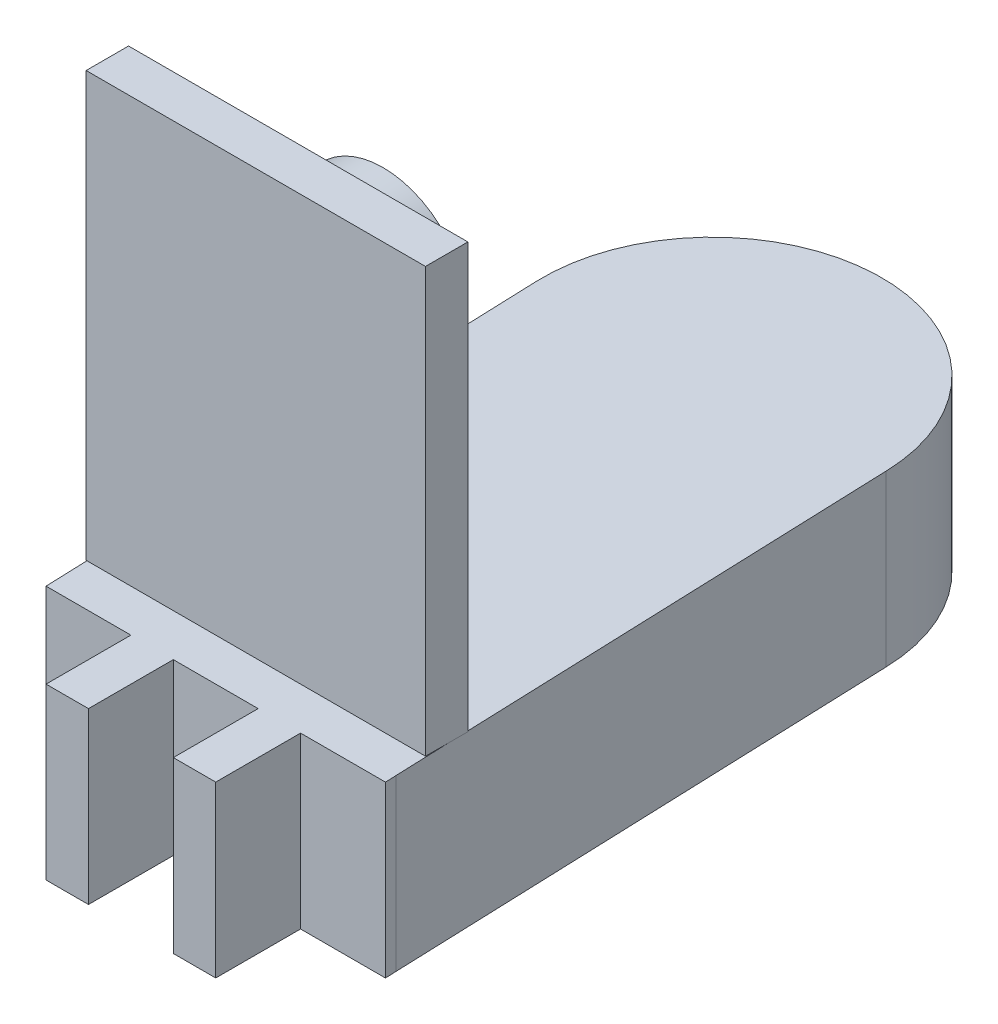
ISO-10303-21;
HEADER;
FILE_DESCRIPTION(('STEP AP214'),'2;1');
FILE_NAME('part.step','',(''),(''),'','','');
FILE_SCHEMA(('AUTOMOTIVE_DESIGN { 1 0 10303 214 1 1 1 1 }'));
ENDSEC;
DATA;
#1=APPLICATION_CONTEXT('core data for automotive mechanical design processes');
#2=APPLICATION_PROTOCOL_DEFINITION('international standard','automotive_design',2000,#1);
#3=PRODUCT_CONTEXT('',#1,'mechanical');
#4=PRODUCT('Part','Part','',(#3));
#5=PRODUCT_RELATED_PRODUCT_CATEGORY('part','',(#4));
#6=PRODUCT_DEFINITION_FORMATION('','',#4);
#7=PRODUCT_DEFINITION_CONTEXT('part definition',#1,'design');
#8=PRODUCT_DEFINITION('design','',#6,#7);
#9=PRODUCT_DEFINITION_SHAPE('','',#8);
#10=(LENGTH_UNIT() NAMED_UNIT(*) SI_UNIT(.MILLI.,.METRE.));
#11=(NAMED_UNIT(*) PLANE_ANGLE_UNIT() SI_UNIT($,.RADIAN.));
#12=(NAMED_UNIT(*) SI_UNIT($,.STERADIAN.) SOLID_ANGLE_UNIT());
#13=UNCERTAINTY_MEASURE_WITH_UNIT(LENGTH_MEASURE(1.E-05),#10,'distance_accuracy_value','');
#14=(GEOMETRIC_REPRESENTATION_CONTEXT(3) GLOBAL_UNCERTAINTY_ASSIGNED_CONTEXT((#13)) GLOBAL_UNIT_ASSIGNED_CONTEXT((#10,
#11,#12)) REPRESENTATION_CONTEXT('',''));
#15=CARTESIAN_POINT('',(0.,0.,0.));
#16=DIRECTION('',(0.,0.,1.));
#17=DIRECTION('',(1.,0.,0.));
#18=AXIS2_PLACEMENT_3D('',#15,#16,#17);
#19=CARTESIAN_POINT('',(0.,20.,0.));
#20=DIRECTION('',(0.,1.,0.));
#21=DIRECTION('',(0.,0.,1.));
#22=AXIS2_PLACEMENT_3D('',#19,#20,#21);
#23=PLANE('',#22);
#24=DIRECTION('',(0.,0.,-1.));
#25=VECTOR('',#24,1.);
#26=CARTESIAN_POINT('',(21.9548219841854,20.,55.7386707293782));
#27=LINE('',#26,#25);
#28=CARTESIAN_POINT('',(21.9548219841854,20.,55.7386707293782));
#29=VERTEX_POINT('',#28);
#30=CARTESIAN_POINT('',(21.9548219841853,20.,53.1100421623011));
#31=VERTEX_POINT('',#30);
#32=EDGE_CURVE('E54',#29,#31,#27,.T.);
#33=ORIENTED_EDGE('',*,*,#32,.F.);
#34=DIRECTION('',(1.,0.,0.));
#35=VECTOR('',#34,1.);
#36=CARTESIAN_POINT('',(-18.0451780158147,20.,55.7386707293782));
#37=LINE('',#36,#35);
#38=CARTESIAN_POINT('',(-17.9527410410248,20.,55.7386707293782));
#39=VERTEX_POINT('',#38);
#40=EDGE_CURVE('E47',#39,#29,#37,.T.);
#41=ORIENTED_EDGE('',*,*,#40,.F.);
#42=DIRECTION('',(0.036949541035634,0.,0.999317132554654));
#43=VECTOR('',#42,1.);
#44=CARTESIAN_POINT('',(-19.9863426510931,20.,0.73899082071268));
#45=LINE('',#44,#43);
#46=CARTESIAN_POINT('',(-17.7678552561351,20.,60.7389908207127));
#47=VERTEX_POINT('',#46);
#48=EDGE_CURVE('E232',#39,#47,#45,.T.);
#49=ORIENTED_EDGE('',*,*,#48,.T.);
#50=DIRECTION('',(1.,0.,0.));
#51=VECTOR('',#50,1.);
#52=CARTESIAN_POINT('',(-4.10924877806938E-13,20.,60.7389908207128));
#53=LINE('',#52,#51);
#54=CARTESIAN_POINT('',(-7.76785525613508,20.,60.7389908207128));
#55=VERTEX_POINT('',#54);
#56=EDGE_CURVE('E215',#47,#55,#53,.T.);
#57=ORIENTED_EDGE('',*,*,#56,.T.);
#58=DIRECTION('',(0.,0.,-1.));
#59=VECTOR('',#58,1.);
#60=CARTESIAN_POINT('',(-7.76785525613465,20.,0.));
#61=LINE('',#60,#59);
#62=CARTESIAN_POINT('',(-7.76785525613511,20.,70.7389908207127));
#63=VERTEX_POINT('',#62);
#64=EDGE_CURVE('E203',#63,#55,#61,.T.);
#65=ORIENTED_EDGE('',*,*,#64,.F.);
#66=DIRECTION('',(1.,0.,0.));
#67=VECTOR('',#66,1.);
#68=CARTESIAN_POINT('',(-1.96340140869758E-13,20.,70.7389908207127));
#69=LINE('',#68,#67);
#70=CARTESIAN_POINT('',(-2.76785525613513,20.,70.7389908207127));
#71=VERTEX_POINT('',#70);
#72=EDGE_CURVE('E206',#63,#71,#69,.T.);
#73=ORIENTED_EDGE('',*,*,#72,.T.);
#74=DIRECTION('',(0.,0.,1.));
#75=VECTOR('',#74,1.);
#76=CARTESIAN_POINT('',(-2.76785525613513,20.,0.));
#77=LINE('',#76,#75);
#78=CARTESIAN_POINT('',(-2.76785525613513,20.,60.7389908207128));
#79=VERTEX_POINT('',#78);
#80=EDGE_CURVE('E209',#79,#71,#77,.T.);
#81=ORIENTED_EDGE('',*,*,#80,.F.);
#82=CARTESIAN_POINT('',(7.23214474386486,20.,60.7389908207128));
#83=VERTEX_POINT('',#82);
#84=EDGE_CURVE('E212',#79,#83,#53,.T.);
#85=ORIENTED_EDGE('',*,*,#84,.T.);
#86=DIRECTION('',(0.,0.,1.));
#87=VECTOR('',#86,1.);
#88=CARTESIAN_POINT('',(7.23214474386485,20.,0.));
#89=LINE('',#88,#87);
#90=CARTESIAN_POINT('',(7.23214474386487,20.,70.7389908207127));
#91=VERTEX_POINT('',#90);
#92=EDGE_CURVE('E214',#83,#91,#89,.T.);
#93=ORIENTED_EDGE('',*,*,#92,.T.);
#94=DIRECTION('',(1.,0.,0.));
#95=VECTOR('',#94,1.);
#96=CARTESIAN_POINT('',(-3.92680281739511E-12,20.,70.7389908207123));
#97=LINE('',#96,#95);
#98=CARTESIAN_POINT('',(12.2321447438649,20.,70.738990820713));
#99=VERTEX_POINT('',#98);
#100=EDGE_CURVE('E218',#91,#99,#97,.T.);
#101=ORIENTED_EDGE('',*,*,#100,.T.);
#102=DIRECTION('',(0.,0.,-1.));
#103=VECTOR('',#102,1.);
#104=CARTESIAN_POINT('',(12.2321447438649,20.,0.));
#105=LINE('',#104,#103);
#106=CARTESIAN_POINT('',(12.2321447438649,20.,60.7389908207129));
#107=VERTEX_POINT('',#106);
#108=EDGE_CURVE('E220',#99,#107,#105,.T.);
#109=ORIENTED_EDGE('',*,*,#108,.T.);
#110=CARTESIAN_POINT('',(22.2321447438649,20.,60.738990820713));
#111=VERTEX_POINT('',#110);
#112=EDGE_CURVE('E216',#107,#111,#53,.T.);
#113=ORIENTED_EDGE('',*,*,#112,.T.);
#114=CARTESIAN_POINT('',(3.75827749976099,20.,60.738990820713));
#115=DIRECTION('',(0.,1.,0.));
#116=DIRECTION('',(0.,0.,1.));
#117=AXIS2_PLACEMENT_3D('',#114,#115,#116);
#118=CIRCLE('',#117,18.4738672441039);
#119=CARTESIAN_POINT('',(22.1862659250692,20.,59.4378322794576));
#120=VERTEX_POINT('',#119);
#121=EDGE_CURVE('E222',#111,#120,#118,.T.);
#122=ORIENTED_EDGE('',*,*,#121,.T.);
#123=DIRECTION('',(0.0365513520868455,0.,0.999331776068701));
#124=VECTOR('',#123,1.);
#125=CARTESIAN_POINT('',(19.9855436477845,20.,-0.730987105594619));
#126=LINE('',#125,#124);
#127=EDGE_CURVE('E225',#31,#120,#126,.T.);
#128=ORIENTED_EDGE('',*,*,#127,.F.);
#129=EDGE_LOOP('',(#33,#41,#49,#57,#65,#73,#81,#85,#93,#101,#109,#113,#122,#128));
#130=FACE_BOUND('',#129,.T.);
#131=ADVANCED_FACE('F39',(#130),#23,.T.);
#132=CARTESIAN_POINT('',(-7.76785525613465,20.,0.));
#133=DIRECTION('',(-1.,0.,0.));
#134=DIRECTION('',(0.,0.,1.));
#135=AXIS2_PLACEMENT_3D('',#132,#133,#134);
#136=PLANE('',#135);
#137=DIRECTION('',(0.,0.,-1.));
#138=VECTOR('',#137,1.);
#139=CARTESIAN_POINT('',(-7.76785525613465,0.,0.));
#140=LINE('',#139,#138);
#141=CARTESIAN_POINT('',(-7.76785525613511,0.,70.7389908207127));
#142=VERTEX_POINT('',#141);
#143=CARTESIAN_POINT('',(-7.76785525613508,0.,60.7389908207128));
#144=VERTEX_POINT('',#143);
#145=EDGE_CURVE('E194',#142,#144,#140,.T.);
#146=ORIENTED_EDGE('',*,*,#145,.F.);
#147=DIRECTION('',(0.,-1.,0.));
#148=VECTOR('',#147,1.);
#149=CARTESIAN_POINT('',(-7.76785525613511,20.,70.7389908207127));
#150=LINE('',#149,#148);
#151=EDGE_CURVE('E291',#63,#142,#150,.T.);
#152=ORIENTED_EDGE('',*,*,#151,.F.);
#153=ORIENTED_EDGE('',*,*,#64,.T.);
#154=DIRECTION('',(0.,-1.,0.));
#155=VECTOR('',#154,1.);
#156=CARTESIAN_POINT('',(-7.76785525613508,20.,60.7389908207128));
#157=LINE('',#156,#155);
#158=EDGE_CURVE('E261',#55,#144,#157,.T.);
#159=ORIENTED_EDGE('',*,*,#158,.T.);
#160=EDGE_LOOP('',(#146,#152,#153,#159));
#161=FACE_BOUND('',#160,.T.);
#162=ADVANCED_FACE('F41',(#161),#136,.T.);
#163=CARTESIAN_POINT('',(-1.96340140869758E-13,20.,70.7389908207127));
#164=DIRECTION('',(0.,0.,-1.));
#165=DIRECTION('',(-1.,0.,0.));
#166=AXIS2_PLACEMENT_3D('',#163,#164,#165);
#167=PLANE('',#166);
#168=DIRECTION('',(1.,0.,0.));
#169=VECTOR('',#168,1.);
#170=CARTESIAN_POINT('',(-1.96340140869758E-13,0.,70.7389908207127));
#171=LINE('',#170,#169);
#172=CARTESIAN_POINT('',(-2.76785525613513,0.,70.7389908207127));
#173=VERTEX_POINT('',#172);
#174=EDGE_CURVE('E197',#142,#173,#171,.T.);
#175=ORIENTED_EDGE('',*,*,#174,.T.);
#176=DIRECTION('',(0.,-1.,0.));
#177=VECTOR('',#176,1.);
#178=CARTESIAN_POINT('',(-2.76785525613513,20.,70.7389908207127));
#179=LINE('',#178,#177);
#180=EDGE_CURVE('E290',#71,#173,#179,.T.);
#181=ORIENTED_EDGE('',*,*,#180,.F.);
#182=ORIENTED_EDGE('',*,*,#72,.F.);
#183=ORIENTED_EDGE('',*,*,#151,.T.);
#184=EDGE_LOOP('',(#175,#181,#182,#183));
#185=FACE_BOUND('',#184,.T.);
#186=ADVANCED_FACE('F338',(#185),#167,.F.);
#187=CARTESIAN_POINT('',(-2.76785525613513,20.,0.));
#188=DIRECTION('',(1.,0.,0.));
#189=DIRECTION('',(0.,0.,-1.));
#190=AXIS2_PLACEMENT_3D('',#187,#188,#189);
#191=PLANE('',#190);
#192=DIRECTION('',(0.,0.,1.));
#193=VECTOR('',#192,1.);
#194=CARTESIAN_POINT('',(-2.76785525613513,0.,0.));
#195=LINE('',#194,#193);
#196=CARTESIAN_POINT('',(-2.76785525613513,0.,60.7389908207128));
#197=VERTEX_POINT('',#196);
#198=EDGE_CURVE('E239',#197,#173,#195,.T.);
#199=ORIENTED_EDGE('',*,*,#198,.F.);
#200=DIRECTION('',(0.,-1.,0.));
#201=VECTOR('',#200,1.);
#202=CARTESIAN_POINT('',(-2.76785525613513,20.,60.7389908207128));
#203=LINE('',#202,#201);
#204=EDGE_CURVE('E288',#79,#197,#203,.T.);
#205=ORIENTED_EDGE('',*,*,#204,.F.);
#206=ORIENTED_EDGE('',*,*,#80,.T.);
#207=ORIENTED_EDGE('',*,*,#180,.T.);
#208=EDGE_LOOP('',(#199,#205,#206,#207));
#209=FACE_BOUND('',#208,.T.);
#210=ADVANCED_FACE('F557',(#209),#191,.T.);
#211=CARTESIAN_POINT('',(-4.10924877806938E-13,20.,60.7389908207128));
#212=DIRECTION('',(0.,0.,-1.));
#213=DIRECTION('',(-1.,0.,0.));
#214=AXIS2_PLACEMENT_3D('',#211,#212,#213);
#215=PLANE('',#214);
#216=DIRECTION('',(1.,0.,0.));
#217=VECTOR('',#216,1.);
#218=CARTESIAN_POINT('',(-4.10924877806938E-13,0.,60.7389908207128));
#219=LINE('',#218,#217);
#220=CARTESIAN_POINT('',(7.23214474386486,0.,60.7389908207128));
#221=VERTEX_POINT('',#220);
#222=EDGE_CURVE('E242',#197,#221,#219,.T.);
#223=ORIENTED_EDGE('',*,*,#222,.T.);
#224=DIRECTION('',(0.,-1.,0.));
#225=VECTOR('',#224,1.);
#226=CARTESIAN_POINT('',(7.23214474386486,20.,60.7389908207128));
#227=LINE('',#226,#225);
#228=EDGE_CURVE('E285',#83,#221,#227,.T.);
#229=ORIENTED_EDGE('',*,*,#228,.F.);
#230=ORIENTED_EDGE('',*,*,#84,.F.);
#231=ORIENTED_EDGE('',*,*,#204,.T.);
#232=EDGE_LOOP('',(#223,#229,#230,#231));
#233=FACE_BOUND('',#232,.T.);
#234=ADVANCED_FACE('F353',(#233),#215,.F.);
#235=CARTESIAN_POINT('',(7.23214474386485,20.,0.));
#236=DIRECTION('',(1.,0.,0.));
#237=DIRECTION('',(0.,0.,-1.));
#238=AXIS2_PLACEMENT_3D('',#235,#236,#237);
#239=PLANE('',#238);
#240=DIRECTION('',(0.,0.,1.));
#241=VECTOR('',#240,1.);
#242=CARTESIAN_POINT('',(7.23214474386485,0.,0.));
#243=LINE('',#242,#241);
#244=CARTESIAN_POINT('',(7.23214474386487,0.,70.7389908207127));
#245=VERTEX_POINT('',#244);
#246=EDGE_CURVE('E244',#221,#245,#243,.T.);
#247=ORIENTED_EDGE('',*,*,#246,.T.);
#248=DIRECTION('',(0.,-1.,0.));
#249=VECTOR('',#248,1.);
#250=CARTESIAN_POINT('',(7.23214474386487,20.,70.7389908207127));
#251=LINE('',#250,#249);
#252=EDGE_CURVE('E282',#91,#245,#251,.T.);
#253=ORIENTED_EDGE('',*,*,#252,.F.);
#254=ORIENTED_EDGE('',*,*,#92,.F.);
#255=ORIENTED_EDGE('',*,*,#228,.T.);
#256=EDGE_LOOP('',(#247,#253,#254,#255));
#257=FACE_BOUND('',#256,.T.);
#258=ADVANCED_FACE('F538',(#257),#239,.F.);
#259=CARTESIAN_POINT('',(-3.92680281739511E-12,20.,70.7389908207123));
#260=DIRECTION('',(0.,0.,-1.));
#261=DIRECTION('',(-1.,0.,0.));
#262=AXIS2_PLACEMENT_3D('',#259,#260,#261);
#263=PLANE('',#262);
#264=DIRECTION('',(1.,0.,0.));
#265=VECTOR('',#264,1.);
#266=CARTESIAN_POINT('',(-3.92680281739511E-12,0.,70.7389908207123));
#267=LINE('',#266,#265);
#268=CARTESIAN_POINT('',(12.2321447438649,0.,70.738990820713));
#269=VERTEX_POINT('',#268);
#270=EDGE_CURVE('E247',#245,#269,#267,.T.);
#271=ORIENTED_EDGE('',*,*,#270,.T.);
#272=DIRECTION('',(0.,-1.,0.));
#273=VECTOR('',#272,1.);
#274=CARTESIAN_POINT('',(12.2321447438649,20.,70.738990820713));
#275=LINE('',#274,#273);
#276=EDGE_CURVE('E279',#99,#269,#275,.T.);
#277=ORIENTED_EDGE('',*,*,#276,.F.);
#278=ORIENTED_EDGE('',*,*,#100,.F.);
#279=ORIENTED_EDGE('',*,*,#252,.T.);
#280=EDGE_LOOP('',(#271,#277,#278,#279));
#281=FACE_BOUND('',#280,.T.);
#282=ADVANCED_FACE('F527',(#281),#263,.F.);
#283=CARTESIAN_POINT('',(12.2321447438649,20.,0.));
#284=DIRECTION('',(-1.,0.,0.));
#285=DIRECTION('',(0.,0.,1.));
#286=AXIS2_PLACEMENT_3D('',#283,#284,#285);
#287=PLANE('',#286);
#288=DIRECTION('',(0.,0.,-1.));
#289=VECTOR('',#288,1.);
#290=CARTESIAN_POINT('',(12.2321447438649,0.,0.));
#291=LINE('',#290,#289);
#292=CARTESIAN_POINT('',(12.2321447438649,0.,60.7389908207129));
#293=VERTEX_POINT('',#292);
#294=EDGE_CURVE('E249',#269,#293,#291,.T.);
#295=ORIENTED_EDGE('',*,*,#294,.T.);
#296=DIRECTION('',(0.,-1.,0.));
#297=VECTOR('',#296,1.);
#298=CARTESIAN_POINT('',(12.2321447438649,20.,60.7389908207129));
#299=LINE('',#298,#297);
#300=EDGE_CURVE('E276',#107,#293,#299,.T.);
#301=ORIENTED_EDGE('',*,*,#300,.F.);
#302=ORIENTED_EDGE('',*,*,#108,.F.);
#303=ORIENTED_EDGE('',*,*,#276,.T.);
#304=EDGE_LOOP('',(#295,#301,#302,#303));
#305=FACE_BOUND('',#304,.T.);
#306=ADVANCED_FACE('F518',(#305),#287,.F.);
#307=CARTESIAN_POINT('',(22.2321447438649,0.,60.738990820713));
#308=VERTEX_POINT('',#307);
#309=EDGE_CURVE('E245',#293,#308,#219,.T.);
#310=ORIENTED_EDGE('',*,*,#309,.T.);
#311=DIRECTION('',(0.,-1.,0.));
#312=VECTOR('',#311,1.);
#313=CARTESIAN_POINT('',(22.2321447438649,20.,60.738990820713));
#314=LINE('',#313,#312);
#315=EDGE_CURVE('E273',#111,#308,#314,.T.);
#316=ORIENTED_EDGE('',*,*,#315,.F.);
#317=ORIENTED_EDGE('',*,*,#112,.F.);
#318=ORIENTED_EDGE('',*,*,#300,.T.);
#319=EDGE_LOOP('',(#310,#316,#317,#318));
#320=FACE_BOUND('',#319,.T.);
#321=ADVANCED_FACE('F354',(#320),#215,.F.);
#322=CARTESIAN_POINT('',(3.75827749976099,20.,60.738990820713));
#323=DIRECTION('',(0.,-1.,0.));
#324=DIRECTION('',(0.,0.,-1.));
#325=AXIS2_PLACEMENT_3D('',#322,#323,#324);
#326=CYLINDRICAL_SURFACE('',#325,18.4738672441039);
#327=CARTESIAN_POINT('',(3.75827749976099,0.,60.738990820713));
#328=DIRECTION('',(0.,1.,0.));
#329=DIRECTION('',(0.,0.,1.));
#330=AXIS2_PLACEMENT_3D('',#327,#328,#329);
#331=CIRCLE('',#330,18.4738672441039);
#332=CARTESIAN_POINT('',(22.1862659250692,0.,59.4378322794576));
#333=VERTEX_POINT('',#332);
#334=EDGE_CURVE('E251',#308,#333,#331,.T.);
#335=ORIENTED_EDGE('',*,*,#334,.T.);
#336=DIRECTION('',(0.,-1.,0.));
#337=VECTOR('',#336,1.);
#338=CARTESIAN_POINT('',(22.1862659250692,20.,59.4378322794576));
#339=LINE('',#338,#337);
#340=EDGE_CURVE('E271',#120,#333,#339,.T.);
#341=ORIENTED_EDGE('',*,*,#340,.F.);
#342=ORIENTED_EDGE('',*,*,#121,.F.);
#343=ORIENTED_EDGE('',*,*,#315,.T.);
#344=EDGE_LOOP('',(#335,#341,#342,#343));
#345=FACE_BOUND('',#344,.T.);
#346=ADVANCED_FACE('F385',(#345),#326,.T.);
#347=CARTESIAN_POINT('',(19.9855436477845,20.,-0.730987105594619));
#348=DIRECTION('',(0.999331776068701,0.,-0.0365513520868454));
#349=DIRECTION('',(-0.0365513520868454,0.,-0.999331776068701));
#350=AXIS2_PLACEMENT_3D('',#347,#348,#349);
#351=PLANE('',#350);
#352=DIRECTION('',(0.0365513520868455,0.,0.999331776068701));
#353=VECTOR('',#352,1.);
#354=CARTESIAN_POINT('',(19.9855436477845,0.,-0.730987105594619));
#355=LINE('',#354,#353);
#356=CARTESIAN_POINT('',(19.9931847998585,0.,-0.522074284664429));
#357=VERTEX_POINT('',#356);
#358=EDGE_CURVE('E254',#357,#333,#355,.T.);
#359=ORIENTED_EDGE('',*,*,#358,.F.);
#360=DIRECTION('',(0.,-1.,0.));
#361=VECTOR('',#360,1.);
#362=CARTESIAN_POINT('',(19.9931847998585,20.,-0.522074284664429));
#363=LINE('',#362,#361);
#364=CARTESIAN_POINT('',(19.9931847998585,20.,-0.522074284664429));
#365=VERTEX_POINT('',#364);
#366=EDGE_CURVE('E269',#365,#357,#363,.T.);
#367=ORIENTED_EDGE('',*,*,#366,.F.);
#368=CARTESIAN_POINT('',(21.8680871937492,20.,50.7386707293782));
#369=VERTEX_POINT('',#368);
#370=EDGE_CURVE('E226',#365,#369,#126,.T.);
#371=ORIENTED_EDGE('',*,*,#370,.T.);
#372=EDGE_CURVE('E230',#369,#31,#126,.T.);
#373=ORIENTED_EDGE('',*,*,#372,.T.);
#374=ORIENTED_EDGE('',*,*,#127,.T.);
#375=ORIENTED_EDGE('',*,*,#340,.T.);
#376=EDGE_LOOP('',(#359,#367,#371,#373,#374,#375));
#377=FACE_BOUND('',#376,.T.);
#378=ADVANCED_FACE('F388',(#377),#351,.T.);
#379=CARTESIAN_POINT('',(0.,20.,0.));
#380=DIRECTION('',(0.,-1.,0.));
#381=DIRECTION('',(0.,0.,-1.));
#382=AXIS2_PLACEMENT_3D('',#379,#380,#381);
#383=CYLINDRICAL_SURFACE('',#382,20.);
#384=CARTESIAN_POINT('',(0.,0.,0.));
#385=DIRECTION('',(0.,1.,0.));
#386=DIRECTION('',(0.,0.,1.));
#387=AXIS2_PLACEMENT_3D('',#384,#385,#386);
#388=CIRCLE('',#387,20.);
#389=CARTESIAN_POINT('',(-19.9863426510931,0.,0.738990820712681));
#390=VERTEX_POINT('',#389);
#391=EDGE_CURVE('E257',#357,#390,#388,.T.);
#392=ORIENTED_EDGE('',*,*,#391,.T.);
#393=DIRECTION('',(0.,-1.,0.));
#394=VECTOR('',#393,1.);
#395=CARTESIAN_POINT('',(-19.9863426510931,20.,0.738990820712681));
#396=LINE('',#395,#394);
#397=CARTESIAN_POINT('',(-19.9863426510931,20.,0.738990820712681));
#398=VERTEX_POINT('',#397);
#399=EDGE_CURVE('E266',#398,#390,#396,.T.);
#400=ORIENTED_EDGE('',*,*,#399,.F.);
#401=CARTESIAN_POINT('',(0.,20.,0.));
#402=DIRECTION('',(0.,1.,0.));
#403=DIRECTION('',(0.,0.,1.));
#404=AXIS2_PLACEMENT_3D('',#401,#402,#403);
#405=CIRCLE('',#404,20.);
#406=EDGE_CURVE('E229',#365,#398,#405,.T.);
#407=ORIENTED_EDGE('',*,*,#406,.F.);
#408=ORIENTED_EDGE('',*,*,#366,.T.);
#409=EDGE_LOOP('',(#392,#400,#407,#408));
#410=FACE_BOUND('',#409,.T.);
#411=ADVANCED_FACE('F463',(#410),#383,.T.);
#412=CARTESIAN_POINT('',(-19.9863426510931,20.,0.73899082071268));
#413=DIRECTION('',(0.999317132554654,0.,-0.036949541035634));
#414=DIRECTION('',(-0.036949541035634,0.,-0.999317132554654));
#415=AXIS2_PLACEMENT_3D('',#412,#413,#414);
#416=PLANE('',#415);
#417=DIRECTION('',(0.036949541035634,0.,0.999317132554654));
#418=VECTOR('',#417,1.);
#419=CARTESIAN_POINT('',(-19.9863426510931,0.,0.73899082071268));
#420=LINE('',#419,#418);
#421=CARTESIAN_POINT('',(-17.7678552561351,0.,60.7389908207127));
#422=VERTEX_POINT('',#421);
#423=EDGE_CURVE('E259',#390,#422,#420,.T.);
#424=ORIENTED_EDGE('',*,*,#423,.T.);
#425=DIRECTION('',(0.,-1.,0.));
#426=VECTOR('',#425,1.);
#427=CARTESIAN_POINT('',(-17.7678552561351,20.,60.7389908207127));
#428=LINE('',#427,#426);
#429=EDGE_CURVE('E263',#47,#422,#428,.T.);
#430=ORIENTED_EDGE('',*,*,#429,.F.);
#431=ORIENTED_EDGE('',*,*,#48,.F.);
#432=CARTESIAN_POINT('',(-18.0451780158147,20.,53.2386707293797));
#433=VERTEX_POINT('',#432);
#434=EDGE_CURVE('E235',#433,#39,#45,.T.);
#435=ORIENTED_EDGE('',*,*,#434,.F.);
#436=EDGE_CURVE('E233',#398,#433,#45,.T.);
#437=ORIENTED_EDGE('',*,*,#436,.F.);
#438=ORIENTED_EDGE('',*,*,#399,.T.);
#439=EDGE_LOOP('',(#424,#430,#431,#435,#437,#438));
#440=FACE_BOUND('',#439,.T.);
#441=ADVANCED_FACE('F350',(#440),#416,.F.);
#442=EDGE_CURVE('E207',#422,#144,#219,.T.);
#443=ORIENTED_EDGE('',*,*,#442,.T.);
#444=ORIENTED_EDGE('',*,*,#158,.F.);
#445=ORIENTED_EDGE('',*,*,#56,.F.);
#446=ORIENTED_EDGE('',*,*,#429,.T.);
#447=EDGE_LOOP('',(#443,#444,#445,#446));
#448=FACE_BOUND('',#447,.T.);
#449=ADVANCED_FACE('F343',(#448),#215,.F.);
#450=DIRECTION('',(0.,0.,1.));
#451=VECTOR('',#450,1.);
#452=CARTESIAN_POINT('',(-18.0451780158147,20.,55.7386707293782));
#453=LINE('',#452,#451);
#454=CARTESIAN_POINT('',(-18.0451780158147,20.,50.7386707293782));
#455=VERTEX_POINT('',#454);
#456=EDGE_CURVE('E302',#455,#433,#453,.T.);
#457=ORIENTED_EDGE('',*,*,#456,.F.);
#458=DIRECTION('',(-1.,0.,0.));
#459=VECTOR('',#458,1.);
#460=CARTESIAN_POINT('',(-18.0451780158147,20.,50.7386707293782));
#461=LINE('',#460,#459);
#462=EDGE_CURVE('E292',#369,#455,#461,.T.);
#463=ORIENTED_EDGE('',*,*,#462,.F.);
#464=ORIENTED_EDGE('',*,*,#370,.F.);
#465=ORIENTED_EDGE('',*,*,#406,.T.);
#466=ORIENTED_EDGE('',*,*,#436,.T.);
#467=EDGE_LOOP('',(#457,#463,#464,#465,#466));
#468=FACE_BOUND('',#467,.T.);
#469=ADVANCED_FACE('F334',(#468),#23,.T.);
#470=CARTESIAN_POINT('',(0.,0.,0.));
#471=DIRECTION('',(0.,1.,0.));
#472=DIRECTION('',(0.,0.,1.));
#473=AXIS2_PLACEMENT_3D('',#470,#471,#472);
#474=PLANE('',#473);
#475=ORIENTED_EDGE('',*,*,#145,.T.);
#476=ORIENTED_EDGE('',*,*,#442,.F.);
#477=ORIENTED_EDGE('',*,*,#423,.F.);
#478=ORIENTED_EDGE('',*,*,#391,.F.);
#479=ORIENTED_EDGE('',*,*,#358,.T.);
#480=ORIENTED_EDGE('',*,*,#334,.F.);
#481=ORIENTED_EDGE('',*,*,#309,.F.);
#482=ORIENTED_EDGE('',*,*,#294,.F.);
#483=ORIENTED_EDGE('',*,*,#270,.F.);
#484=ORIENTED_EDGE('',*,*,#246,.F.);
#485=ORIENTED_EDGE('',*,*,#222,.F.);
#486=ORIENTED_EDGE('',*,*,#198,.T.);
#487=ORIENTED_EDGE('',*,*,#174,.F.);
#488=EDGE_LOOP('',(#475,#476,#477,#478,#479,#480,#481,#482,#483,#484,#485,#486,#487));
#489=FACE_BOUND('',#488,.T.);
#490=ADVANCED_FACE('F342',(#489),#474,.F.);
#491=CARTESIAN_POINT('',(0.,20.,0.));
#492=DIRECTION('',(0.,-1.,0.));
#493=DIRECTION('',(0.,0.,-1.));
#494=AXIS2_PLACEMENT_3D('',#491,#492,#493);
#495=PLANE('',#494);
#496=ORIENTED_EDGE('',*,*,#372,.F.);
#497=CARTESIAN_POINT('',(21.9548219841854,20.,50.7386707293782));
#498=VERTEX_POINT('',#497);
#499=EDGE_CURVE('E297',#498,#369,#461,.T.);
#500=ORIENTED_EDGE('',*,*,#499,.F.);
#501=EDGE_CURVE('E192',#31,#498,#27,.T.);
#502=ORIENTED_EDGE('',*,*,#501,.F.);
#503=EDGE_LOOP('',(#496,#500,#502));
#504=FACE_BOUND('',#503,.T.);
#505=ADVANCED_FACE('F330',(#504),#495,.T.);
#506=CARTESIAN_POINT('',(21.9548219841854,70.,55.7386707293782));
#507=DIRECTION('',(-1.,0.,0.));
#508=DIRECTION('',(0.,0.,1.));
#509=AXIS2_PLACEMENT_3D('',#506,#507,#508);
#510=PLANE('',#509);
#511=ORIENTED_EDGE('',*,*,#32,.T.);
#512=ORIENTED_EDGE('',*,*,#501,.T.);
#513=DIRECTION('',(0.,-1.,0.));
#514=VECTOR('',#513,1.);
#515=CARTESIAN_POINT('',(21.9548219841854,70.,50.7386707293782));
#516=LINE('',#515,#514);
#517=CARTESIAN_POINT('',(21.9548219841854,70.,50.7386707293782));
#518=VERTEX_POINT('',#517);
#519=EDGE_CURVE('E172',#518,#498,#516,.T.);
#520=ORIENTED_EDGE('',*,*,#519,.F.);
#521=DIRECTION('',(0.,0.,-1.));
#522=VECTOR('',#521,1.);
#523=CARTESIAN_POINT('',(21.9548219841854,70.,55.7386707293782));
#524=LINE('',#523,#522);
#525=CARTESIAN_POINT('',(21.9548219841854,70.,55.7386707293782));
#526=VERTEX_POINT('',#525);
#527=EDGE_CURVE('E179',#526,#518,#524,.T.);
#528=ORIENTED_EDGE('',*,*,#527,.F.);
#529=DIRECTION('',(0.,-1.,0.));
#530=VECTOR('',#529,1.);
#531=CARTESIAN_POINT('',(21.9548219841854,70.,55.7386707293782));
#532=LINE('',#531,#530);
#533=EDGE_CURVE('E306',#526,#29,#532,.T.);
#534=ORIENTED_EDGE('',*,*,#533,.T.);
#535=EDGE_LOOP('',(#511,#512,#520,#528,#534));
#536=FACE_BOUND('',#535,.T.);
#537=ADVANCED_FACE('F190',(#536),#510,.F.);
#538=CARTESIAN_POINT('',(-18.0451780158147,70.,50.7386707293782));
#539=DIRECTION('',(0.,0.,1.));
#540=DIRECTION('',(1.,0.,0.));
#541=AXIS2_PLACEMENT_3D('',#538,#539,#540);
#542=PLANE('',#541);
#543=CARTESIAN_POINT('',(1.9548219841853,52.5960550157699,50.7386707293782));
#544=DIRECTION('',(0.,0.,1.));
#545=DIRECTION('',(1.,0.,0.));
#546=AXIS2_PLACEMENT_3D('',#543,#544,#545);
#547=CIRCLE('',#546,10.);
#548=CARTESIAN_POINT('',(11.9548219841853,52.5960550157699,50.7386707293782));
#549=VERTEX_POINT('',#548);
#550=EDGE_CURVE('E11',#549,#549,#547,.F.);
#551=ORIENTED_EDGE('',*,*,#550,.F.);
#552=EDGE_LOOP('',(#551));
#553=FACE_BOUND('',#552,.T.);
#554=ORIENTED_EDGE('',*,*,#499,.T.);
#555=ORIENTED_EDGE('',*,*,#462,.T.);
#556=DIRECTION('',(0.,-1.,0.));
#557=VECTOR('',#556,1.);
#558=CARTESIAN_POINT('',(-18.0451780158147,70.,50.7386707293782));
#559=LINE('',#558,#557);
#560=CARTESIAN_POINT('',(-18.0451780158147,70.,50.7386707293782));
#561=VERTEX_POINT('',#560);
#562=EDGE_CURVE('E175',#561,#455,#559,.T.);
#563=ORIENTED_EDGE('',*,*,#562,.F.);
#564=DIRECTION('',(-1.,0.,0.));
#565=VECTOR('',#564,1.);
#566=CARTESIAN_POINT('',(-18.0451780158147,70.,50.7386707293782));
#567=LINE('',#566,#565);
#568=EDGE_CURVE('E167',#518,#561,#567,.T.);
#569=ORIENTED_EDGE('',*,*,#568,.F.);
#570=ORIENTED_EDGE('',*,*,#519,.T.);
#571=EDGE_LOOP('',(#554,#555,#563,#569,#570));
#572=FACE_BOUND('',#571,.T.);
#573=ADVANCED_FACE('F170',(#553,#572),#542,.F.);
#574=CARTESIAN_POINT('',(-18.0451780158147,70.,55.7386707293782));
#575=DIRECTION('',(1.,0.,0.));
#576=DIRECTION('',(0.,0.,-1.));
#577=AXIS2_PLACEMENT_3D('',#574,#575,#576);
#578=PLANE('',#577);
#579=ORIENTED_EDGE('',*,*,#456,.T.);
#580=CARTESIAN_POINT('',(-18.0451780158147,20.,55.7386707293782));
#581=VERTEX_POINT('',#580);
#582=EDGE_CURVE('E301',#433,#581,#453,.T.);
#583=ORIENTED_EDGE('',*,*,#582,.T.);
#584=DIRECTION('',(0.,-1.,0.));
#585=VECTOR('',#584,1.);
#586=CARTESIAN_POINT('',(-18.0451780158147,70.,55.7386707293782));
#587=LINE('',#586,#585);
#588=CARTESIAN_POINT('',(-18.0451780158147,70.,55.7386707293782));
#589=VERTEX_POINT('',#588);
#590=EDGE_CURVE('E199',#589,#581,#587,.T.);
#591=ORIENTED_EDGE('',*,*,#590,.F.);
#592=DIRECTION('',(0.,0.,1.));
#593=VECTOR('',#592,1.);
#594=CARTESIAN_POINT('',(-18.0451780158147,70.,55.7386707293782));
#595=LINE('',#594,#593);
#596=EDGE_CURVE('E178',#561,#589,#595,.T.);
#597=ORIENTED_EDGE('',*,*,#596,.F.);
#598=ORIENTED_EDGE('',*,*,#562,.T.);
#599=EDGE_LOOP('',(#579,#583,#591,#597,#598));
#600=FACE_BOUND('',#599,.T.);
#601=ADVANCED_FACE('F321',(#600),#578,.F.);
#602=CARTESIAN_POINT('',(-18.0451780158147,70.,55.7386707293782));
#603=DIRECTION('',(0.,0.,-1.));
#604=DIRECTION('',(-1.,0.,0.));
#605=AXIS2_PLACEMENT_3D('',#602,#603,#604);
#606=PLANE('',#605);
#607=EDGE_CURVE('E188',#581,#39,#37,.T.);
#608=ORIENTED_EDGE('',*,*,#607,.T.);
#609=ORIENTED_EDGE('',*,*,#40,.T.);
#610=ORIENTED_EDGE('',*,*,#533,.F.);
#611=DIRECTION('',(1.,0.,0.));
#612=VECTOR('',#611,1.);
#613=CARTESIAN_POINT('',(-18.0451780158147,70.,55.7386707293782));
#614=LINE('',#613,#612);
#615=EDGE_CURVE('E184',#589,#526,#614,.T.);
#616=ORIENTED_EDGE('',*,*,#615,.F.);
#617=ORIENTED_EDGE('',*,*,#590,.T.);
#618=EDGE_LOOP('',(#608,#609,#610,#616,#617));
#619=FACE_BOUND('',#618,.T.);
#620=ADVANCED_FACE('F327',(#619),#606,.F.);
#621=CARTESIAN_POINT('',(0.,70.,0.));
#622=DIRECTION('',(0.,-1.,0.));
#623=DIRECTION('',(0.,0.,-1.));
#624=AXIS2_PLACEMENT_3D('',#621,#622,#623);
#625=PLANE('',#624);
#626=ORIENTED_EDGE('',*,*,#527,.T.);
#627=ORIENTED_EDGE('',*,*,#568,.T.);
#628=ORIENTED_EDGE('',*,*,#596,.T.);
#629=ORIENTED_EDGE('',*,*,#615,.T.);
#630=EDGE_LOOP('',(#626,#627,#628,#629));
#631=FACE_BOUND('',#630,.T.);
#632=ADVANCED_FACE('F182',(#631),#625,.F.);
#633=ORIENTED_EDGE('',*,*,#582,.F.);
#634=ORIENTED_EDGE('',*,*,#434,.T.);
#635=ORIENTED_EDGE('',*,*,#607,.F.);
#636=EDGE_LOOP('',(#633,#634,#635));
#637=FACE_BOUND('',#636,.T.);
#638=ADVANCED_FACE('F316',(#637),#495,.T.);
#639=CARTESIAN_POINT('',(1.9548219841853,52.5960550157699,40.7386707293782));
#640=DIRECTION('',(0.,0.,1.));
#641=DIRECTION('',(1.,0.,0.));
#642=AXIS2_PLACEMENT_3D('',#639,#640,#641);
#643=CYLINDRICAL_SURFACE('',#642,10.);
#644=CARTESIAN_POINT('',(1.9548219841853,52.5960550157699,40.7386707293782));
#645=DIRECTION('',(0.,0.,-1.));
#646=DIRECTION('',(-1.,0.,0.));
#647=AXIS2_PLACEMENT_3D('',#644,#645,#646);
#648=CIRCLE('',#647,10.);
#649=CARTESIAN_POINT('',(-8.04517801581471,52.5960550157699,40.7386707293782));
#650=VERTEX_POINT('',#649);
#651=EDGE_CURVE('E303',#650,#650,#648,.T.);
#652=ORIENTED_EDGE('',*,*,#651,.F.);
#653=EDGE_LOOP('',(#652));
#654=FACE_BOUND('',#653,.T.);
#655=ORIENTED_EDGE('',*,*,#550,.T.);
#656=EDGE_LOOP('',(#655));
#657=FACE_BOUND('',#656,.T.);
#658=ADVANCED_FACE('F313',(#654,#657),#643,.T.);
#659=CARTESIAN_POINT('',(1.9548219841853,52.5960550157699,40.7386707293782));
#660=DIRECTION('',(0.,0.,-1.));
#661=DIRECTION('',(-1.,0.,0.));
#662=AXIS2_PLACEMENT_3D('',#659,#660,#661);
#663=PLANE('',#662);
#664=ORIENTED_EDGE('',*,*,#651,.T.);
#665=EDGE_LOOP('',(#664));
#666=FACE_BOUND('',#665,.T.);
#667=ADVANCED_FACE('F311',(#666),#663,.T.);
#668=CLOSED_SHELL('',(#131,#162,#186,#210,#234,#258,#282,#306,#321,#346,#378,#411,#441,#449,
#469,#490,#505,#537,#573,#601,#620,#632,#638,#658,#667));
#669=MANIFOLD_SOLID_BREP('B2',#668);
#670=ADVANCED_BREP_SHAPE_REPRESENTATION('',(#18,#669),#14);
#671=SHAPE_DEFINITION_REPRESENTATION(#9,#670);
ENDSEC;
END-ISO-10303-21;
